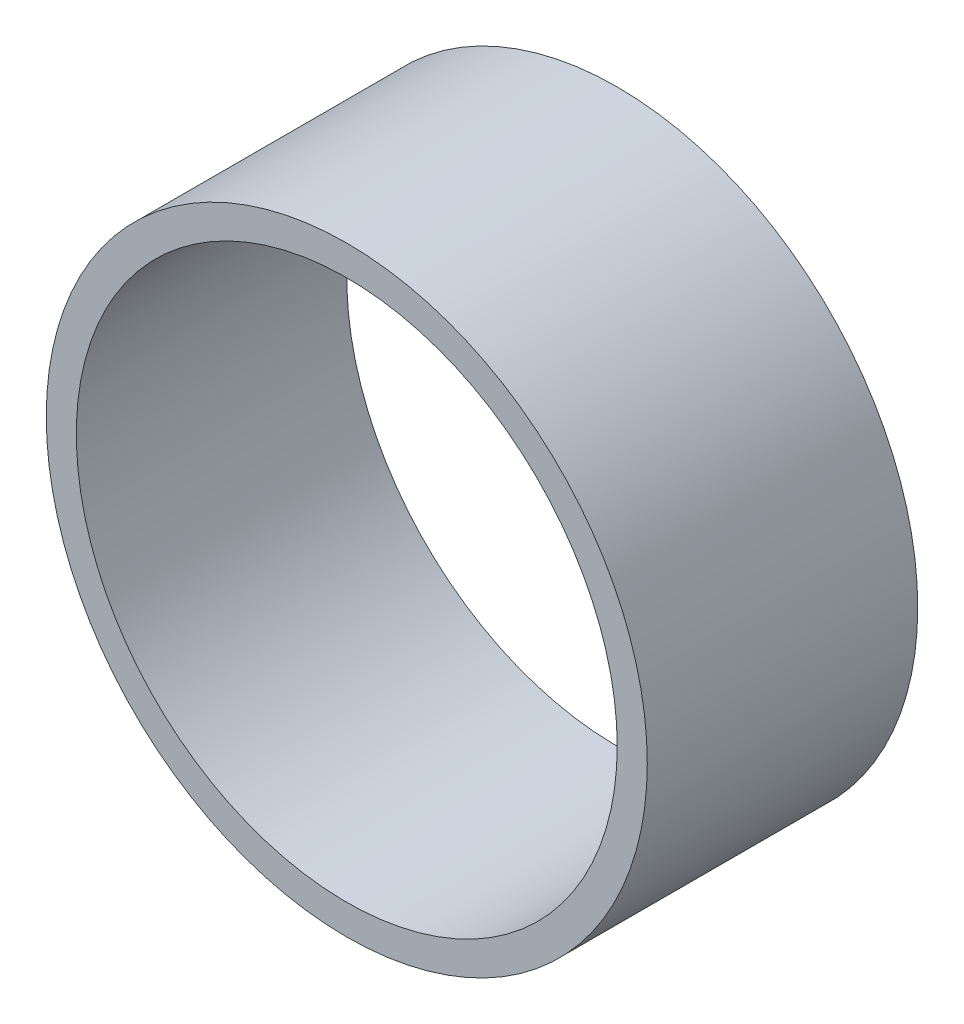
ISO-10303-21;
HEADER;
FILE_DESCRIPTION(('STEP AP214'),'2;1');
FILE_NAME('part.step','',(''),(''),'','','');
FILE_SCHEMA(('AUTOMOTIVE_DESIGN { 1 0 10303 214 1 1 1 1 }'));
ENDSEC;
DATA;
#1=APPLICATION_CONTEXT('core data for automotive mechanical design processes');
#2=APPLICATION_PROTOCOL_DEFINITION('international standard','automotive_design',2000,#1);
#3=PRODUCT_CONTEXT('',#1,'mechanical');
#4=PRODUCT('Part','Part','',(#3));
#5=PRODUCT_RELATED_PRODUCT_CATEGORY('part','',(#4));
#6=PRODUCT_DEFINITION_FORMATION('','',#4);
#7=PRODUCT_DEFINITION_CONTEXT('part definition',#1,'design');
#8=PRODUCT_DEFINITION('design','',#6,#7);
#9=PRODUCT_DEFINITION_SHAPE('','',#8);
#10=(LENGTH_UNIT() NAMED_UNIT(*) SI_UNIT(.MILLI.,.METRE.));
#11=(NAMED_UNIT(*) PLANE_ANGLE_UNIT() SI_UNIT($,.RADIAN.));
#12=(NAMED_UNIT(*) SI_UNIT($,.STERADIAN.) SOLID_ANGLE_UNIT());
#13=UNCERTAINTY_MEASURE_WITH_UNIT(LENGTH_MEASURE(1.E-05),#10,'distance_accuracy_value','');
#14=(GEOMETRIC_REPRESENTATION_CONTEXT(3) GLOBAL_UNCERTAINTY_ASSIGNED_CONTEXT((#13)) GLOBAL_UNIT_ASSIGNED_CONTEXT((#10,
#11,#12)) REPRESENTATION_CONTEXT('',''));
#15=CARTESIAN_POINT('',(0.,0.,0.));
#16=DIRECTION('',(0.,0.,1.));
#17=DIRECTION('',(1.,0.,0.));
#18=AXIS2_PLACEMENT_3D('',#15,#16,#17);
#19=CARTESIAN_POINT('',(0.,0.,10.8));
#20=DIRECTION('',(0.,0.,-1.));
#21=DIRECTION('',(-1.,0.,0.));
#22=AXIS2_PLACEMENT_3D('',#19,#20,#21);
#23=CYLINDRICAL_SURFACE('',#22,12.);
#24=CARTESIAN_POINT('',(0.,0.,10.8));
#25=DIRECTION('',(0.,0.,1.));
#26=DIRECTION('',(1.,0.,0.));
#27=AXIS2_PLACEMENT_3D('',#24,#25,#26);
#28=CIRCLE('',#27,12.);
#29=CARTESIAN_POINT('',(12.,0.,10.8));
#30=VERTEX_POINT('',#29);
#31=EDGE_CURVE('E10',#30,#30,#28,.T.);
#32=ORIENTED_EDGE('',*,*,#31,.F.);
#33=EDGE_LOOP('',(#32));
#34=FACE_BOUND('',#33,.T.);
#35=CARTESIAN_POINT('',(0.,0.,0.));
#36=DIRECTION('',(0.,0.,1.));
#37=DIRECTION('',(1.,0.,0.));
#38=AXIS2_PLACEMENT_3D('',#35,#36,#37);
#39=CIRCLE('',#38,12.);
#40=CARTESIAN_POINT('',(12.,0.,0.));
#41=VERTEX_POINT('',#40);
#42=EDGE_CURVE('E36',#41,#41,#39,.T.);
#43=ORIENTED_EDGE('',*,*,#42,.T.);
#44=EDGE_LOOP('',(#43));
#45=FACE_BOUND('',#44,.T.);
#46=ADVANCED_FACE('F33',(#34,#45),#23,.T.);
#47=CARTESIAN_POINT('',(0.,0.,10.8));
#48=DIRECTION('',(0.,0.,1.));
#49=DIRECTION('',(1.,0.,0.));
#50=AXIS2_PLACEMENT_3D('',#47,#48,#49);
#51=PLANE('',#50);
#52=CARTESIAN_POINT('',(0.,0.,10.8));
#53=DIRECTION('',(0.,0.,1.));
#54=DIRECTION('',(1.,0.,0.));
#55=AXIS2_PLACEMENT_3D('',#52,#53,#54);
#56=CIRCLE('',#55,10.8);
#57=CARTESIAN_POINT('',(10.8,0.,10.8));
#58=VERTEX_POINT('',#57);
#59=EDGE_CURVE('E43',#58,#58,#56,.T.);
#60=ORIENTED_EDGE('',*,*,#59,.F.);
#61=EDGE_LOOP('',(#60));
#62=FACE_BOUND('',#61,.T.);
#63=ORIENTED_EDGE('',*,*,#31,.T.);
#64=EDGE_LOOP('',(#63));
#65=FACE_BOUND('',#64,.T.);
#66=ADVANCED_FACE('F54',(#62,#65),#51,.T.);
#67=CARTESIAN_POINT('',(0.,0.,0.));
#68=DIRECTION('',(0.,0.,1.));
#69=DIRECTION('',(1.,0.,0.));
#70=AXIS2_PLACEMENT_3D('',#67,#68,#69);
#71=PLANE('',#70);
#72=CARTESIAN_POINT('',(0.,0.,0.));
#73=DIRECTION('',(0.,0.,1.));
#74=DIRECTION('',(1.,0.,0.));
#75=AXIS2_PLACEMENT_3D('',#72,#73,#74);
#76=CIRCLE('',#75,10.8);
#77=CARTESIAN_POINT('',(10.8,0.,0.));
#78=VERTEX_POINT('',#77);
#79=EDGE_CURVE('E45',#78,#78,#76,.T.);
#80=ORIENTED_EDGE('',*,*,#79,.T.);
#81=EDGE_LOOP('',(#80));
#82=FACE_BOUND('',#81,.T.);
#83=ORIENTED_EDGE('',*,*,#42,.F.);
#84=EDGE_LOOP('',(#83));
#85=FACE_BOUND('',#84,.T.);
#86=ADVANCED_FACE('F56',(#82,#85),#71,.F.);
#87=CARTESIAN_POINT('',(0.,0.,10.8));
#88=DIRECTION('',(0.,0.,-1.));
#89=DIRECTION('',(-1.,0.,0.));
#90=AXIS2_PLACEMENT_3D('',#87,#88,#89);
#91=CYLINDRICAL_SURFACE('',#90,10.8);
#92=ORIENTED_EDGE('',*,*,#59,.T.);
#93=EDGE_LOOP('',(#92));
#94=FACE_BOUND('',#93,.T.);
#95=ORIENTED_EDGE('',*,*,#79,.F.);
#96=EDGE_LOOP('',(#95));
#97=FACE_BOUND('',#96,.T.);
#98=ADVANCED_FACE('F51',(#94,#97),#91,.F.);
#99=CLOSED_SHELL('',(#46,#66,#86,#98));
#100=MANIFOLD_SOLID_BREP('B2',#99);
#101=ADVANCED_BREP_SHAPE_REPRESENTATION('',(#18,#100),#14);
#102=SHAPE_DEFINITION_REPRESENTATION(#9,#101);
ENDSEC;
END-ISO-10303-21;
